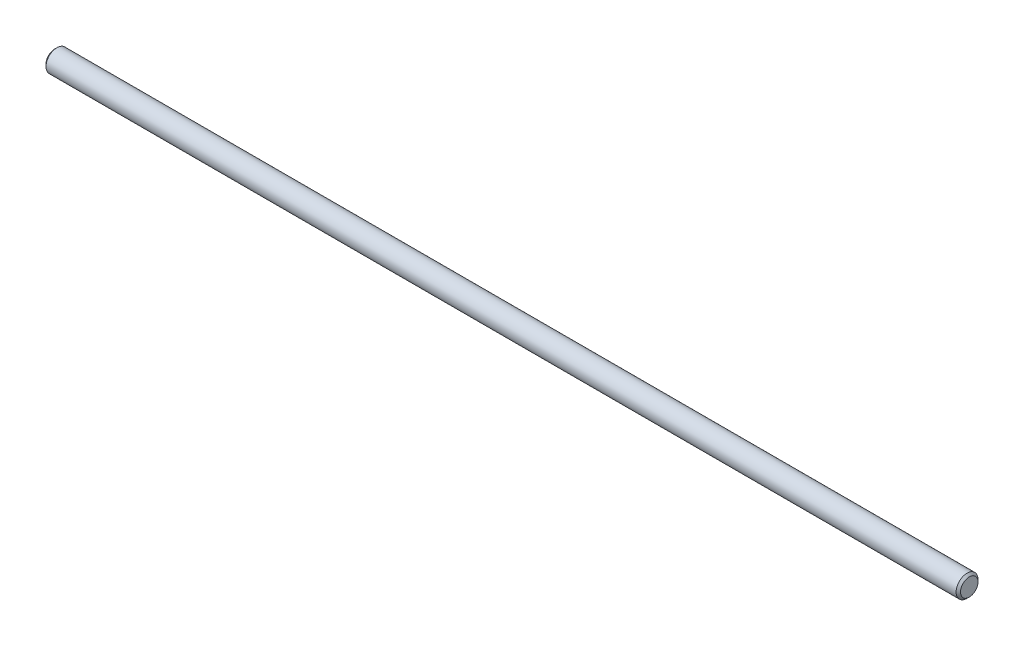
ISO-10303-21;
HEADER;
FILE_DESCRIPTION(('STEP AP214'),'2;1');
FILE_NAME('part.step','',(''),(''),'','','');
FILE_SCHEMA(('AUTOMOTIVE_DESIGN { 1 0 10303 214 1 1 1 1 }'));
ENDSEC;
DATA;
#1=APPLICATION_CONTEXT('core data for automotive mechanical design processes');
#2=APPLICATION_PROTOCOL_DEFINITION('international standard','automotive_design',2000,#1);
#3=PRODUCT_CONTEXT('',#1,'mechanical');
#4=PRODUCT('Part','Part','',(#3));
#5=PRODUCT_RELATED_PRODUCT_CATEGORY('part','',(#4));
#6=PRODUCT_DEFINITION_FORMATION('','',#4);
#7=PRODUCT_DEFINITION_CONTEXT('part definition',#1,'design');
#8=PRODUCT_DEFINITION('design','',#6,#7);
#9=PRODUCT_DEFINITION_SHAPE('','',#8);
#10=(LENGTH_UNIT() NAMED_UNIT(*) SI_UNIT(.MILLI.,.METRE.));
#11=(NAMED_UNIT(*) PLANE_ANGLE_UNIT() SI_UNIT($,.RADIAN.));
#12=(NAMED_UNIT(*) SI_UNIT($,.STERADIAN.) SOLID_ANGLE_UNIT());
#13=UNCERTAINTY_MEASURE_WITH_UNIT(LENGTH_MEASURE(1.E-05),#10,'distance_accuracy_value','');
#14=(GEOMETRIC_REPRESENTATION_CONTEXT(3) GLOBAL_UNCERTAINTY_ASSIGNED_CONTEXT((#13)) GLOBAL_UNIT_ASSIGNED_CONTEXT((#10,
#11,#12)) REPRESENTATION_CONTEXT('',''));
#15=CARTESIAN_POINT('',(0.,0.,0.));
#16=DIRECTION('',(0.,0.,1.));
#17=DIRECTION('',(1.,0.,0.));
#18=AXIS2_PLACEMENT_3D('',#15,#16,#17);
#19=CARTESIAN_POINT('',(209.,0.,0.));
#20=DIRECTION('',(-1.,0.,0.));
#21=DIRECTION('',(0.,0.,1.));
#22=AXIS2_PLACEMENT_3D('',#19,#20,#21);
#23=CYLINDRICAL_SURFACE('',#22,5.);
#24=CARTESIAN_POINT('',(208.,0.,0.));
#25=DIRECTION('',(1.,0.,0.));
#26=DIRECTION('',(0.,0.,-1.));
#27=AXIS2_PLACEMENT_3D('',#24,#25,#26);
#28=CIRCLE('',#27,5.);
#29=CARTESIAN_POINT('',(208.,0.,-5.));
#30=VERTEX_POINT('',#29);
#31=EDGE_CURVE('E38',#30,#30,#28,.F.);
#32=ORIENTED_EDGE('',*,*,#31,.T.);
#33=EDGE_LOOP('',(#32));
#34=FACE_BOUND('',#33,.T.);
#35=CARTESIAN_POINT('',(-208.,0.,0.));
#36=DIRECTION('',(1.,0.,0.));
#37=DIRECTION('',(0.,0.,-1.));
#38=AXIS2_PLACEMENT_3D('',#35,#36,#37);
#39=CIRCLE('',#38,5.);
#40=CARTESIAN_POINT('',(-208.,0.,-5.));
#41=VERTEX_POINT('',#40);
#42=EDGE_CURVE('E42',#41,#41,#39,.T.);
#43=ORIENTED_EDGE('',*,*,#42,.T.);
#44=EDGE_LOOP('',(#43));
#45=FACE_BOUND('',#44,.T.);
#46=ADVANCED_FACE('F31',(#34,#45),#23,.T.);
#47=CARTESIAN_POINT('',(209.,0.,0.));
#48=DIRECTION('',(1.,0.,0.));
#49=DIRECTION('',(0.,0.,-1.));
#50=AXIS2_PLACEMENT_3D('',#47,#48,#49);
#51=PLANE('',#50);
#52=CARTESIAN_POINT('',(209.,0.,0.));
#53=DIRECTION('',(1.,0.,0.));
#54=DIRECTION('',(0.,0.,-1.));
#55=AXIS2_PLACEMENT_3D('',#52,#53,#54);
#56=CIRCLE('',#55,4.00000000000006);
#57=CARTESIAN_POINT('',(209.,0.,-4.00000000000006));
#58=VERTEX_POINT('',#57);
#59=EDGE_CURVE('E46',#58,#58,#56,.T.);
#60=ORIENTED_EDGE('',*,*,#59,.T.);
#61=EDGE_LOOP('',(#60));
#62=FACE_BOUND('',#61,.T.);
#63=ADVANCED_FACE('F52',(#62),#51,.T.);
#64=CARTESIAN_POINT('',(-209.,0.,0.));
#65=DIRECTION('',(1.,0.,0.));
#66=DIRECTION('',(0.,0.,-1.));
#67=AXIS2_PLACEMENT_3D('',#64,#65,#66);
#68=PLANE('',#67);
#69=CARTESIAN_POINT('',(-209.,0.,0.));
#70=DIRECTION('',(1.,0.,0.));
#71=DIRECTION('',(0.,0.,-1.));
#72=AXIS2_PLACEMENT_3D('',#69,#70,#71);
#73=CIRCLE('',#72,4.00000000000006);
#74=CARTESIAN_POINT('',(-209.,0.,-4.00000000000006));
#75=VERTEX_POINT('',#74);
#76=EDGE_CURVE('E10',#75,#75,#73,.F.);
#77=ORIENTED_EDGE('',*,*,#76,.T.);
#78=EDGE_LOOP('',(#77));
#79=FACE_BOUND('',#78,.T.);
#80=ADVANCED_FACE('F56',(#79),#68,.F.);
#81=CARTESIAN_POINT('',(209.,0.,0.));
#82=DIRECTION('',(-1.,0.,0.));
#83=DIRECTION('',(0.,0.,1.));
#84=AXIS2_PLACEMENT_3D('',#81,#82,#83);
#85=CONICAL_SURFACE('',#84,4.00000000000006,0.785398163397473);
#86=ORIENTED_EDGE('',*,*,#31,.F.);
#87=EDGE_LOOP('',(#86));
#88=FACE_BOUND('',#87,.T.);
#89=ORIENTED_EDGE('',*,*,#59,.F.);
#90=EDGE_LOOP('',(#89));
#91=FACE_BOUND('',#90,.T.);
#92=ADVANCED_FACE('F54',(#88,#91),#85,.T.);
#93=CARTESIAN_POINT('',(-208.,0.,0.));
#94=DIRECTION('',(1.,0.,0.));
#95=DIRECTION('',(0.,0.,-1.));
#96=AXIS2_PLACEMENT_3D('',#93,#94,#95);
#97=CONICAL_SURFACE('',#96,5.,0.785398163397446);
#98=ORIENTED_EDGE('',*,*,#76,.F.);
#99=EDGE_LOOP('',(#98));
#100=FACE_BOUND('',#99,.T.);
#101=ORIENTED_EDGE('',*,*,#42,.F.);
#102=EDGE_LOOP('',(#101));
#103=FACE_BOUND('',#102,.T.);
#104=ADVANCED_FACE('F33',(#100,#103),#97,.T.);
#105=CLOSED_SHELL('',(#46,#63,#80,#92,#104));
#106=MANIFOLD_SOLID_BREP('B2',#105);
#107=ADVANCED_BREP_SHAPE_REPRESENTATION('',(#18,#106),#14);
#108=SHAPE_DEFINITION_REPRESENTATION(#9,#107);
ENDSEC;
END-ISO-10303-21;
